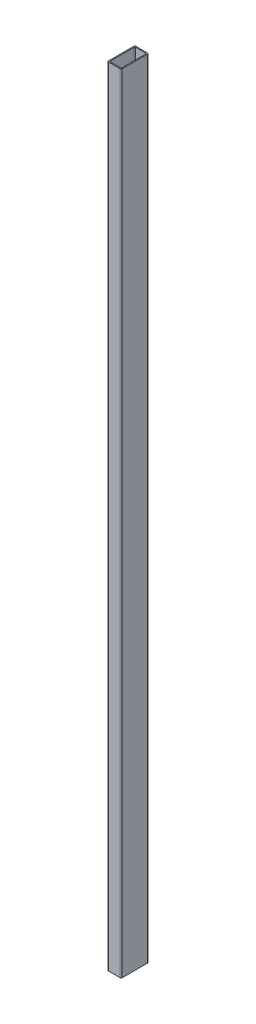
ISO-10303-21;
HEADER;
FILE_DESCRIPTION(('STEP AP214'),'2;1');
FILE_NAME('part.step','',(''),(''),'','','');
FILE_SCHEMA(('AUTOMOTIVE_DESIGN { 1 0 10303 214 1 1 1 1 }'));
ENDSEC;
DATA;
#1=APPLICATION_CONTEXT('core data for automotive mechanical design processes');
#2=APPLICATION_PROTOCOL_DEFINITION('international standard','automotive_design',2000,#1);
#3=PRODUCT_CONTEXT('',#1,'mechanical');
#4=PRODUCT('Part','Part','',(#3));
#5=PRODUCT_RELATED_PRODUCT_CATEGORY('part','',(#4));
#6=PRODUCT_DEFINITION_FORMATION('','',#4);
#7=PRODUCT_DEFINITION_CONTEXT('part definition',#1,'design');
#8=PRODUCT_DEFINITION('design','',#6,#7);
#9=PRODUCT_DEFINITION_SHAPE('','',#8);
#10=(LENGTH_UNIT() NAMED_UNIT(*) SI_UNIT(.MILLI.,.METRE.));
#11=(NAMED_UNIT(*) PLANE_ANGLE_UNIT() SI_UNIT($,.RADIAN.));
#12=(NAMED_UNIT(*) SI_UNIT($,.STERADIAN.) SOLID_ANGLE_UNIT());
#13=UNCERTAINTY_MEASURE_WITH_UNIT(LENGTH_MEASURE(1.E-05),#10,'distance_accuracy_value','');
#14=(GEOMETRIC_REPRESENTATION_CONTEXT(3) GLOBAL_UNCERTAINTY_ASSIGNED_CONTEXT((#13)) GLOBAL_UNIT_ASSIGNED_CONTEXT((#10,
#11,#12)) REPRESENTATION_CONTEXT('',''));
#15=CARTESIAN_POINT('',(0.,0.,0.));
#16=DIRECTION('',(0.,0.,1.));
#17=DIRECTION('',(1.,0.,0.));
#18=AXIS2_PLACEMENT_3D('',#15,#16,#17);
#19=CARTESIAN_POINT('',(-18.5,1149.29577045117,38.5));
#20=DIRECTION('',(0.,-1.,0.));
#21=DIRECTION('',(0.,0.,-1.));
#22=AXIS2_PLACEMENT_3D('',#19,#20,#21);
#23=PLANE('',#22);
#24=CARTESIAN_POINT('',(-18.5,1149.29577045117,38.5));
#25=DIRECTION('',(0.,1.,0.));
#26=DIRECTION('',(0.,0.,-1.));
#27=AXIS2_PLACEMENT_3D('',#24,#25,#26);
#28=CIRCLE('',#27,1.5);
#29=CARTESIAN_POINT('',(-20.,1149.29577045117,38.5));
#30=VERTEX_POINT('',#29);
#31=CARTESIAN_POINT('',(-18.5,1149.29577045117,40.));
#32=VERTEX_POINT('',#31);
#33=EDGE_CURVE('E212',#30,#32,#28,.T.);
#34=ORIENTED_EDGE('',*,*,#33,.T.);
#35=DIRECTION('',(1.,0.,0.));
#36=VECTOR('',#35,1.);
#37=CARTESIAN_POINT('',(-1.49999999999983,1149.29577045117,40.));
#38=LINE('',#37,#36);
#39=CARTESIAN_POINT('',(-1.49999999999983,1149.29577045117,40.));
#40=VERTEX_POINT('',#39);
#41=EDGE_CURVE('E215',#32,#40,#38,.T.);
#42=ORIENTED_EDGE('',*,*,#41,.T.);
#43=CARTESIAN_POINT('',(-1.49999999999983,1149.29577045117,38.5));
#44=DIRECTION('',(0.,1.,0.));
#45=DIRECTION('',(0.,0.,-1.));
#46=AXIS2_PLACEMENT_3D('',#43,#44,#45);
#47=CIRCLE('',#46,1.50000000000001);
#48=CARTESIAN_POINT('',(0.,1149.29577045117,38.5));
#49=VERTEX_POINT('',#48);
#50=EDGE_CURVE('E218',#40,#49,#47,.T.);
#51=ORIENTED_EDGE('',*,*,#50,.T.);
#52=DIRECTION('',(0.,0.,-1.));
#53=VECTOR('',#52,1.);
#54=CARTESIAN_POINT('',(0.,1149.29577045117,38.5));
#55=LINE('',#54,#53);
#56=CARTESIAN_POINT('',(0.,1149.29577045117,1.50000000000003));
#57=VERTEX_POINT('',#56);
#58=EDGE_CURVE('E220',#49,#57,#55,.T.);
#59=ORIENTED_EDGE('',*,*,#58,.T.);
#60=CARTESIAN_POINT('',(-1.49999999999983,1149.29577045117,1.50000000000003));
#61=DIRECTION('',(0.,1.,0.));
#62=DIRECTION('',(0.,0.,1.));
#63=AXIS2_PLACEMENT_3D('',#60,#61,#62);
#64=CIRCLE('',#63,1.5);
#65=CARTESIAN_POINT('',(-1.50000000000006,1149.29577045117,0.));
#66=VERTEX_POINT('',#65);
#67=EDGE_CURVE('E222',#57,#66,#64,.T.);
#68=ORIENTED_EDGE('',*,*,#67,.T.);
#69=DIRECTION('',(-1.,0.,0.));
#70=VECTOR('',#69,1.);
#71=CARTESIAN_POINT('',(-1.50000000000006,1149.29577045117,0.));
#72=LINE('',#71,#70);
#73=CARTESIAN_POINT('',(-18.5,1149.29577045117,0.));
#74=VERTEX_POINT('',#73);
#75=EDGE_CURVE('E224',#66,#74,#72,.T.);
#76=ORIENTED_EDGE('',*,*,#75,.T.);
#77=CARTESIAN_POINT('',(-18.5,1149.29577045117,1.50000000000003));
#78=DIRECTION('',(0.,1.,0.));
#79=DIRECTION('',(0.,0.,-1.));
#80=AXIS2_PLACEMENT_3D('',#77,#78,#79);
#81=CIRCLE('',#80,1.5);
#82=CARTESIAN_POINT('',(-20.,1149.29577045117,1.50000000000003));
#83=VERTEX_POINT('',#82);
#84=EDGE_CURVE('E226',#74,#83,#81,.T.);
#85=ORIENTED_EDGE('',*,*,#84,.T.);
#86=DIRECTION('',(0.,0.,1.));
#87=VECTOR('',#86,1.);
#88=CARTESIAN_POINT('',(-20.,1149.29577045117,38.5));
#89=LINE('',#88,#87);
#90=EDGE_CURVE('E228',#83,#30,#89,.T.);
#91=ORIENTED_EDGE('',*,*,#90,.T.);
#92=EDGE_LOOP('',(#34,#42,#51,#59,#68,#76,#85,#91));
#93=FACE_BOUND('',#92,.T.);
#94=CARTESIAN_POINT('',(-17.4999999999999,1149.29577045117,2.50000000000003));
#95=DIRECTION('',(0.,1.,0.));
#96=DIRECTION('',(0.,0.,-1.));
#97=AXIS2_PLACEMENT_3D('',#94,#95,#96);
#98=CIRCLE('',#97,0.999999999999994);
#99=CARTESIAN_POINT('',(-17.4999999999999,1149.29577045117,1.50000000000006));
#100=VERTEX_POINT('',#99);
#101=CARTESIAN_POINT('',(-18.5,1149.29577045117,2.50000000000003));
#102=VERTEX_POINT('',#101);
#103=EDGE_CURVE('E147',#100,#102,#98,.T.);
#104=ORIENTED_EDGE('',*,*,#103,.F.);
#105=DIRECTION('',(-1.,0.,0.));
#106=VECTOR('',#105,1.);
#107=CARTESIAN_POINT('',(-2.50000000000017,1149.29577045117,1.50000000000003));
#108=LINE('',#107,#106);
#109=CARTESIAN_POINT('',(-2.50000000000017,1149.29577045117,1.50000000000003));
#110=VERTEX_POINT('',#109);
#111=EDGE_CURVE('E180',#110,#100,#108,.T.);
#112=ORIENTED_EDGE('',*,*,#111,.F.);
#113=CARTESIAN_POINT('',(-2.50000000000017,1149.29577045117,2.50000000000003));
#114=DIRECTION('',(0.,1.,0.));
#115=DIRECTION('',(0.,0.,1.));
#116=AXIS2_PLACEMENT_3D('',#113,#114,#115);
#117=CIRCLE('',#116,0.999999999999997);
#118=CARTESIAN_POINT('',(-1.50000000000006,1149.29577045117,2.50000000000003));
#119=VERTEX_POINT('',#118);
#120=EDGE_CURVE('E178',#119,#110,#117,.T.);
#121=ORIENTED_EDGE('',*,*,#120,.F.);
#122=DIRECTION('',(0.,0.,-1.));
#123=VECTOR('',#122,1.);
#124=CARTESIAN_POINT('',(-1.49999999999983,1149.29577045117,37.5));
#125=LINE('',#124,#123);
#126=CARTESIAN_POINT('',(-1.49999999999983,1149.29577045117,37.5));
#127=VERTEX_POINT('',#126);
#128=EDGE_CURVE('E176',#127,#119,#125,.T.);
#129=ORIENTED_EDGE('',*,*,#128,.F.);
#130=CARTESIAN_POINT('',(-2.49999999999995,1149.29577045117,37.5));
#131=DIRECTION('',(0.,1.,0.));
#132=DIRECTION('',(0.,0.,-1.));
#133=AXIS2_PLACEMENT_3D('',#130,#131,#132);
#134=CIRCLE('',#133,1.);
#135=CARTESIAN_POINT('',(-2.49999999999995,1149.29577045117,38.5));
#136=VERTEX_POINT('',#135);
#137=EDGE_CURVE('E174',#136,#127,#134,.T.);
#138=ORIENTED_EDGE('',*,*,#137,.F.);
#139=DIRECTION('',(1.,0.,0.));
#140=VECTOR('',#139,1.);
#141=CARTESIAN_POINT('',(-2.49999999999995,1149.29577045117,38.5));
#142=LINE('',#141,#140);
#143=CARTESIAN_POINT('',(-17.4999999999999,1149.29577045117,38.5));
#144=VERTEX_POINT('',#143);
#145=EDGE_CURVE('E170',#144,#136,#142,.T.);
#146=ORIENTED_EDGE('',*,*,#145,.F.);
#147=CARTESIAN_POINT('',(-17.4999999999999,1149.29577045117,37.5));
#148=DIRECTION('',(0.,1.,0.));
#149=DIRECTION('',(0.,0.,-1.));
#150=AXIS2_PLACEMENT_3D('',#147,#148,#149);
#151=CIRCLE('',#150,1.);
#152=CARTESIAN_POINT('',(-18.5,1149.29577045117,37.5));
#153=VERTEX_POINT('',#152);
#154=EDGE_CURVE('E168',#153,#144,#151,.T.);
#155=ORIENTED_EDGE('',*,*,#154,.F.);
#156=DIRECTION('',(0.,0.,1.));
#157=VECTOR('',#156,1.);
#158=CARTESIAN_POINT('',(-18.5,1149.29577045117,37.5));
#159=LINE('',#158,#157);
#160=EDGE_CURVE('E155',#102,#153,#159,.T.);
#161=ORIENTED_EDGE('',*,*,#160,.F.);
#162=EDGE_LOOP('',(#104,#112,#121,#129,#138,#146,#155,#161));
#163=FACE_BOUND('',#162,.T.);
#164=ADVANCED_FACE('F34',(#93,#163),#23,.F.);
#165=CARTESIAN_POINT('',(-18.5,0.,38.5));
#166=DIRECTION('',(0.,-1.,0.));
#167=DIRECTION('',(0.,0.,-1.));
#168=AXIS2_PLACEMENT_3D('',#165,#166,#167);
#169=PLANE('',#168);
#170=CARTESIAN_POINT('',(-18.5,0.,38.5));
#171=DIRECTION('',(0.,1.,0.));
#172=DIRECTION('',(0.,0.,-1.));
#173=AXIS2_PLACEMENT_3D('',#170,#171,#172);
#174=CIRCLE('',#173,1.5);
#175=CARTESIAN_POINT('',(-20.,0.,38.5));
#176=VERTEX_POINT('',#175);
#177=CARTESIAN_POINT('',(-18.5,0.,40.));
#178=VERTEX_POINT('',#177);
#179=EDGE_CURVE('E163',#176,#178,#174,.T.);
#180=ORIENTED_EDGE('',*,*,#179,.F.);
#181=DIRECTION('',(0.,0.,1.));
#182=VECTOR('',#181,1.);
#183=CARTESIAN_POINT('',(-20.,0.,38.5));
#184=LINE('',#183,#182);
#185=CARTESIAN_POINT('',(-20.,0.,1.50000000000003));
#186=VERTEX_POINT('',#185);
#187=EDGE_CURVE('E216',#186,#176,#184,.T.);
#188=ORIENTED_EDGE('',*,*,#187,.F.);
#189=CARTESIAN_POINT('',(-18.5,0.,1.50000000000003));
#190=DIRECTION('',(0.,1.,0.));
#191=DIRECTION('',(0.,0.,-1.));
#192=AXIS2_PLACEMENT_3D('',#189,#190,#191);
#193=CIRCLE('',#192,1.5);
#194=CARTESIAN_POINT('',(-18.5,0.,0.));
#195=VERTEX_POINT('',#194);
#196=EDGE_CURVE('E243',#195,#186,#193,.T.);
#197=ORIENTED_EDGE('',*,*,#196,.F.);
#198=DIRECTION('',(-1.,0.,0.));
#199=VECTOR('',#198,1.);
#200=CARTESIAN_POINT('',(-1.50000000000006,0.,0.));
#201=LINE('',#200,#199);
#202=CARTESIAN_POINT('',(-1.50000000000006,0.,0.));
#203=VERTEX_POINT('',#202);
#204=EDGE_CURVE('E241',#203,#195,#201,.T.);
#205=ORIENTED_EDGE('',*,*,#204,.F.);
#206=CARTESIAN_POINT('',(-1.49999999999983,0.,1.50000000000003));
#207=DIRECTION('',(0.,1.,0.));
#208=DIRECTION('',(0.,0.,1.));
#209=AXIS2_PLACEMENT_3D('',#206,#207,#208);
#210=CIRCLE('',#209,1.5);
#211=CARTESIAN_POINT('',(0.,0.,1.50000000000003));
#212=VERTEX_POINT('',#211);
#213=EDGE_CURVE('E239',#212,#203,#210,.T.);
#214=ORIENTED_EDGE('',*,*,#213,.F.);
#215=DIRECTION('',(0.,0.,-1.));
#216=VECTOR('',#215,1.);
#217=CARTESIAN_POINT('',(0.,0.,38.5));
#218=LINE('',#217,#216);
#219=CARTESIAN_POINT('',(0.,0.,38.5));
#220=VERTEX_POINT('',#219);
#221=EDGE_CURVE('E237',#220,#212,#218,.T.);
#222=ORIENTED_EDGE('',*,*,#221,.F.);
#223=CARTESIAN_POINT('',(-1.49999999999983,0.,38.5));
#224=DIRECTION('',(0.,1.,0.));
#225=DIRECTION('',(0.,0.,-1.));
#226=AXIS2_PLACEMENT_3D('',#223,#224,#225);
#227=CIRCLE('',#226,1.50000000000001);
#228=CARTESIAN_POINT('',(-1.49999999999983,0.,40.));
#229=VERTEX_POINT('',#228);
#230=EDGE_CURVE('E235',#229,#220,#227,.T.);
#231=ORIENTED_EDGE('',*,*,#230,.F.);
#232=DIRECTION('',(1.,0.,0.));
#233=VECTOR('',#232,1.);
#234=CARTESIAN_POINT('',(-1.49999999999983,0.,40.));
#235=LINE('',#234,#233);
#236=EDGE_CURVE('E233',#178,#229,#235,.T.);
#237=ORIENTED_EDGE('',*,*,#236,.F.);
#238=EDGE_LOOP('',(#180,#188,#197,#205,#214,#222,#231,#237));
#239=FACE_BOUND('',#238,.T.);
#240=DIRECTION('',(-1.,0.,0.));
#241=VECTOR('',#240,1.);
#242=CARTESIAN_POINT('',(-2.50000000000017,0.,1.50000000000003));
#243=LINE('',#242,#241);
#244=CARTESIAN_POINT('',(-2.50000000000017,0.,1.50000000000003));
#245=VERTEX_POINT('',#244);
#246=CARTESIAN_POINT('',(-17.4999999999999,0.,1.50000000000003));
#247=VERTEX_POINT('',#246);
#248=EDGE_CURVE('E156',#245,#247,#243,.T.);
#249=ORIENTED_EDGE('',*,*,#248,.T.);
#250=CARTESIAN_POINT('',(-17.4999999999999,0.,2.50000000000003));
#251=DIRECTION('',(0.,1.,0.));
#252=DIRECTION('',(0.,0.,-1.));
#253=AXIS2_PLACEMENT_3D('',#250,#251,#252);
#254=CIRCLE('',#253,0.999999999999994);
#255=CARTESIAN_POINT('',(-18.5,0.,2.50000000000003));
#256=VERTEX_POINT('',#255);
#257=EDGE_CURVE('E57',#247,#256,#254,.T.);
#258=ORIENTED_EDGE('',*,*,#257,.T.);
#259=DIRECTION('',(0.,0.,1.));
#260=VECTOR('',#259,1.);
#261=CARTESIAN_POINT('',(-18.5,0.,37.5));
#262=LINE('',#261,#260);
#263=CARTESIAN_POINT('',(-18.5,0.,37.5));
#264=VERTEX_POINT('',#263);
#265=EDGE_CURVE('E162',#256,#264,#262,.T.);
#266=ORIENTED_EDGE('',*,*,#265,.T.);
#267=CARTESIAN_POINT('',(-17.4999999999999,0.,37.5));
#268=DIRECTION('',(0.,1.,0.));
#269=DIRECTION('',(0.,0.,-1.));
#270=AXIS2_PLACEMENT_3D('',#267,#268,#269);
#271=CIRCLE('',#270,1.);
#272=CARTESIAN_POINT('',(-17.4999999999999,0.,38.5));
#273=VERTEX_POINT('',#272);
#274=EDGE_CURVE('E184',#264,#273,#271,.T.);
#275=ORIENTED_EDGE('',*,*,#274,.T.);
#276=DIRECTION('',(1.,0.,0.));
#277=VECTOR('',#276,1.);
#278=CARTESIAN_POINT('',(-2.49999999999995,0.,38.5));
#279=LINE('',#278,#277);
#280=CARTESIAN_POINT('',(-2.49999999999995,0.,38.5));
#281=VERTEX_POINT('',#280);
#282=EDGE_CURVE('E187',#273,#281,#279,.T.);
#283=ORIENTED_EDGE('',*,*,#282,.T.);
#284=CARTESIAN_POINT('',(-2.49999999999995,0.,37.5));
#285=DIRECTION('',(0.,1.,0.));
#286=DIRECTION('',(0.,0.,-1.));
#287=AXIS2_PLACEMENT_3D('',#284,#285,#286);
#288=CIRCLE('',#287,1.);
#289=CARTESIAN_POINT('',(-1.49999999999983,0.,37.5));
#290=VERTEX_POINT('',#289);
#291=EDGE_CURVE('E190',#281,#290,#288,.T.);
#292=ORIENTED_EDGE('',*,*,#291,.T.);
#293=DIRECTION('',(0.,0.,-1.));
#294=VECTOR('',#293,1.);
#295=CARTESIAN_POINT('',(-1.49999999999983,0.,37.5));
#296=LINE('',#295,#294);
#297=CARTESIAN_POINT('',(-1.50000000000006,0.,2.50000000000003));
#298=VERTEX_POINT('',#297);
#299=EDGE_CURVE('E193',#290,#298,#296,.T.);
#300=ORIENTED_EDGE('',*,*,#299,.T.);
#301=CARTESIAN_POINT('',(-2.50000000000017,0.,2.50000000000003));
#302=DIRECTION('',(0.,1.,0.));
#303=DIRECTION('',(0.,0.,1.));
#304=AXIS2_PLACEMENT_3D('',#301,#302,#303);
#305=CIRCLE('',#304,0.999999999999997);
#306=EDGE_CURVE('E196',#298,#245,#305,.T.);
#307=ORIENTED_EDGE('',*,*,#306,.T.);
#308=EDGE_LOOP('',(#249,#258,#266,#275,#283,#292,#300,#307));
#309=FACE_BOUND('',#308,.T.);
#310=ADVANCED_FACE('F273',(#239,#309),#169,.T.);
#311=CARTESIAN_POINT('',(-18.5,1149.29577045117,38.5));
#312=DIRECTION('',(0.,-1.,0.));
#313=DIRECTION('',(0.,0.,-1.));
#314=AXIS2_PLACEMENT_3D('',#311,#312,#313);
#315=CYLINDRICAL_SURFACE('',#314,1.5);
#316=ORIENTED_EDGE('',*,*,#179,.T.);
#317=DIRECTION('',(0.,-1.,0.));
#318=VECTOR('',#317,1.);
#319=CARTESIAN_POINT('',(-18.5,1149.29577045117,40.));
#320=LINE('',#319,#318);
#321=EDGE_CURVE('E11',#32,#178,#320,.T.);
#322=ORIENTED_EDGE('',*,*,#321,.F.);
#323=ORIENTED_EDGE('',*,*,#33,.F.);
#324=DIRECTION('',(0.,-1.,0.));
#325=VECTOR('',#324,1.);
#326=CARTESIAN_POINT('',(-20.,1149.29577045117,38.5));
#327=LINE('',#326,#325);
#328=EDGE_CURVE('E230',#30,#176,#327,.T.);
#329=ORIENTED_EDGE('',*,*,#328,.T.);
#330=EDGE_LOOP('',(#316,#322,#323,#329));
#331=FACE_BOUND('',#330,.T.);
#332=ADVANCED_FACE('F36',(#331),#315,.T.);
#333=CARTESIAN_POINT('',(-1.49999999999983,1149.29577045117,40.));
#334=DIRECTION('',(0.,0.,-1.));
#335=DIRECTION('',(-1.,0.,0.));
#336=AXIS2_PLACEMENT_3D('',#333,#334,#335);
#337=PLANE('',#336);
#338=ORIENTED_EDGE('',*,*,#236,.T.);
#339=DIRECTION('',(0.,-1.,0.));
#340=VECTOR('',#339,1.);
#341=CARTESIAN_POINT('',(-1.49999999999983,1149.29577045117,40.));
#342=LINE('',#341,#340);
#343=EDGE_CURVE('E42',#40,#229,#342,.T.);
#344=ORIENTED_EDGE('',*,*,#343,.F.);
#345=ORIENTED_EDGE('',*,*,#41,.F.);
#346=ORIENTED_EDGE('',*,*,#321,.T.);
#347=EDGE_LOOP('',(#338,#344,#345,#346));
#348=FACE_BOUND('',#347,.T.);
#349=ADVANCED_FACE('F290',(#348),#337,.F.);
#350=CARTESIAN_POINT('',(-1.49999999999983,1149.29577045117,38.5));
#351=DIRECTION('',(0.,-1.,0.));
#352=DIRECTION('',(0.,0.,-1.));
#353=AXIS2_PLACEMENT_3D('',#350,#351,#352);
#354=CYLINDRICAL_SURFACE('',#353,1.50000000000001);
#355=ORIENTED_EDGE('',*,*,#230,.T.);
#356=DIRECTION('',(0.,-1.,0.));
#357=VECTOR('',#356,1.);
#358=CARTESIAN_POINT('',(0.,1149.29577045117,38.5));
#359=LINE('',#358,#357);
#360=EDGE_CURVE('E260',#49,#220,#359,.T.);
#361=ORIENTED_EDGE('',*,*,#360,.F.);
#362=ORIENTED_EDGE('',*,*,#50,.F.);
#363=ORIENTED_EDGE('',*,*,#343,.T.);
#364=EDGE_LOOP('',(#355,#361,#362,#363));
#365=FACE_BOUND('',#364,.T.);
#366=ADVANCED_FACE('F267',(#365),#354,.T.);
#367=CARTESIAN_POINT('',(0.,1149.29577045117,38.5));
#368=DIRECTION('',(-1.,0.,0.));
#369=DIRECTION('',(0.,0.,1.));
#370=AXIS2_PLACEMENT_3D('',#367,#368,#369);
#371=PLANE('',#370);
#372=ORIENTED_EDGE('',*,*,#221,.T.);
#373=DIRECTION('',(0.,-1.,0.));
#374=VECTOR('',#373,1.);
#375=CARTESIAN_POINT('',(0.,1149.29577045117,1.50000000000003));
#376=LINE('',#375,#374);
#377=EDGE_CURVE('E257',#57,#212,#376,.T.);
#378=ORIENTED_EDGE('',*,*,#377,.F.);
#379=ORIENTED_EDGE('',*,*,#58,.F.);
#380=ORIENTED_EDGE('',*,*,#360,.T.);
#381=EDGE_LOOP('',(#372,#378,#379,#380));
#382=FACE_BOUND('',#381,.T.);
#383=ADVANCED_FACE('F279',(#382),#371,.F.);
#384=CARTESIAN_POINT('',(-1.49999999999983,1149.29577045117,1.50000000000003));
#385=DIRECTION('',(0.,-1.,0.));
#386=DIRECTION('',(0.,0.,-1.));
#387=AXIS2_PLACEMENT_3D('',#384,#385,#386);
#388=CYLINDRICAL_SURFACE('',#387,1.5);
#389=ORIENTED_EDGE('',*,*,#213,.T.);
#390=DIRECTION('',(0.,-1.,0.));
#391=VECTOR('',#390,1.);
#392=CARTESIAN_POINT('',(-1.50000000000006,1149.29577045117,0.));
#393=LINE('',#392,#391);
#394=EDGE_CURVE('E254',#66,#203,#393,.T.);
#395=ORIENTED_EDGE('',*,*,#394,.F.);
#396=ORIENTED_EDGE('',*,*,#67,.F.);
#397=ORIENTED_EDGE('',*,*,#377,.T.);
#398=EDGE_LOOP('',(#389,#395,#396,#397));
#399=FACE_BOUND('',#398,.T.);
#400=ADVANCED_FACE('F283',(#399),#388,.T.);
#401=CARTESIAN_POINT('',(-1.50000000000006,1149.29577045117,0.));
#402=DIRECTION('',(0.,0.,1.));
#403=DIRECTION('',(1.,0.,0.));
#404=AXIS2_PLACEMENT_3D('',#401,#402,#403);
#405=PLANE('',#404);
#406=ORIENTED_EDGE('',*,*,#204,.T.);
#407=DIRECTION('',(0.,-1.,0.));
#408=VECTOR('',#407,1.);
#409=CARTESIAN_POINT('',(-18.5,1149.29577045117,0.));
#410=LINE('',#409,#408);
#411=EDGE_CURVE('E251',#74,#195,#410,.T.);
#412=ORIENTED_EDGE('',*,*,#411,.F.);
#413=ORIENTED_EDGE('',*,*,#75,.F.);
#414=ORIENTED_EDGE('',*,*,#394,.T.);
#415=EDGE_LOOP('',(#406,#412,#413,#414));
#416=FACE_BOUND('',#415,.T.);
#417=ADVANCED_FACE('F303',(#416),#405,.F.);
#418=CARTESIAN_POINT('',(-18.5,1149.29577045117,1.50000000000003));
#419=DIRECTION('',(0.,-1.,0.));
#420=DIRECTION('',(0.,0.,-1.));
#421=AXIS2_PLACEMENT_3D('',#418,#419,#420);
#422=CYLINDRICAL_SURFACE('',#421,1.5);
#423=ORIENTED_EDGE('',*,*,#196,.T.);
#424=DIRECTION('',(0.,-1.,0.));
#425=VECTOR('',#424,1.);
#426=CARTESIAN_POINT('',(-20.,1149.29577045117,1.50000000000003));
#427=LINE('',#426,#425);
#428=EDGE_CURVE('E248',#83,#186,#427,.T.);
#429=ORIENTED_EDGE('',*,*,#428,.F.);
#430=ORIENTED_EDGE('',*,*,#84,.F.);
#431=ORIENTED_EDGE('',*,*,#411,.T.);
#432=EDGE_LOOP('',(#423,#429,#430,#431));
#433=FACE_BOUND('',#432,.T.);
#434=ADVANCED_FACE('F301',(#433),#422,.T.);
#435=CARTESIAN_POINT('',(-20.,1149.29577045117,38.5));
#436=DIRECTION('',(1.,0.,0.));
#437=DIRECTION('',(0.,0.,-1.));
#438=AXIS2_PLACEMENT_3D('',#435,#436,#437);
#439=PLANE('',#438);
#440=ORIENTED_EDGE('',*,*,#187,.T.);
#441=ORIENTED_EDGE('',*,*,#328,.F.);
#442=ORIENTED_EDGE('',*,*,#90,.F.);
#443=ORIENTED_EDGE('',*,*,#428,.T.);
#444=EDGE_LOOP('',(#440,#441,#442,#443));
#445=FACE_BOUND('',#444,.T.);
#446=ADVANCED_FACE('F296',(#445),#439,.F.);
#447=CARTESIAN_POINT('',(-17.4999999999999,1149.29577045117,2.50000000000003));
#448=DIRECTION('',(0.,-1.,0.));
#449=DIRECTION('',(0.,0.,-1.));
#450=AXIS2_PLACEMENT_3D('',#447,#448,#449);
#451=CYLINDRICAL_SURFACE('',#450,0.999999999999994);
#452=ORIENTED_EDGE('',*,*,#257,.F.);
#453=DIRECTION('',(0.,-1.,0.));
#454=VECTOR('',#453,1.);
#455=CARTESIAN_POINT('',(-17.4999999999999,1149.29577045117,1.50000000000006));
#456=LINE('',#455,#454);
#457=EDGE_CURVE('E151',#100,#247,#456,.T.);
#458=ORIENTED_EDGE('',*,*,#457,.F.);
#459=ORIENTED_EDGE('',*,*,#103,.T.);
#460=DIRECTION('',(0.,-1.,0.));
#461=VECTOR('',#460,1.);
#462=CARTESIAN_POINT('',(-18.5,1149.29577045117,2.50000000000003));
#463=LINE('',#462,#461);
#464=EDGE_CURVE('E150',#102,#256,#463,.T.);
#465=ORIENTED_EDGE('',*,*,#464,.T.);
#466=EDGE_LOOP('',(#452,#458,#459,#465));
#467=FACE_BOUND('',#466,.T.);
#468=ADVANCED_FACE('F149',(#467),#451,.F.);
#469=CARTESIAN_POINT('',(-18.5,1149.29577045117,37.5));
#470=DIRECTION('',(1.,0.,0.));
#471=DIRECTION('',(0.,0.,-1.));
#472=AXIS2_PLACEMENT_3D('',#469,#470,#471);
#473=PLANE('',#472);
#474=ORIENTED_EDGE('',*,*,#265,.F.);
#475=ORIENTED_EDGE('',*,*,#464,.F.);
#476=ORIENTED_EDGE('',*,*,#160,.T.);
#477=DIRECTION('',(0.,-1.,0.));
#478=VECTOR('',#477,1.);
#479=CARTESIAN_POINT('',(-18.5,1149.29577045117,37.5));
#480=LINE('',#479,#478);
#481=EDGE_CURVE('E164',#153,#264,#480,.T.);
#482=ORIENTED_EDGE('',*,*,#481,.T.);
#483=EDGE_LOOP('',(#474,#475,#476,#482));
#484=FACE_BOUND('',#483,.T.);
#485=ADVANCED_FACE('F159',(#484),#473,.T.);
#486=CARTESIAN_POINT('',(-17.4999999999999,1149.29577045117,37.5));
#487=DIRECTION('',(0.,-1.,0.));
#488=DIRECTION('',(0.,0.,-1.));
#489=AXIS2_PLACEMENT_3D('',#486,#487,#488);
#490=CYLINDRICAL_SURFACE('',#489,1.);
#491=ORIENTED_EDGE('',*,*,#274,.F.);
#492=ORIENTED_EDGE('',*,*,#481,.F.);
#493=ORIENTED_EDGE('',*,*,#154,.T.);
#494=DIRECTION('',(0.,-1.,0.));
#495=VECTOR('',#494,1.);
#496=CARTESIAN_POINT('',(-17.4999999999999,1149.29577045117,38.5));
#497=LINE('',#496,#495);
#498=EDGE_CURVE('E209',#144,#273,#497,.T.);
#499=ORIENTED_EDGE('',*,*,#498,.T.);
#500=EDGE_LOOP('',(#491,#492,#493,#499));
#501=FACE_BOUND('',#500,.T.);
#502=ADVANCED_FACE('F328',(#501),#490,.F.);
#503=CARTESIAN_POINT('',(-2.49999999999995,1149.29577045117,38.5));
#504=DIRECTION('',(0.,0.,-1.));
#505=DIRECTION('',(-1.,0.,0.));
#506=AXIS2_PLACEMENT_3D('',#503,#504,#505);
#507=PLANE('',#506);
#508=ORIENTED_EDGE('',*,*,#282,.F.);
#509=ORIENTED_EDGE('',*,*,#498,.F.);
#510=ORIENTED_EDGE('',*,*,#145,.T.);
#511=DIRECTION('',(0.,-1.,0.));
#512=VECTOR('',#511,1.);
#513=CARTESIAN_POINT('',(-2.49999999999995,1149.29577045117,38.5));
#514=LINE('',#513,#512);
#515=EDGE_CURVE('E207',#136,#281,#514,.T.);
#516=ORIENTED_EDGE('',*,*,#515,.T.);
#517=EDGE_LOOP('',(#508,#509,#510,#516));
#518=FACE_BOUND('',#517,.T.);
#519=ADVANCED_FACE('F332',(#518),#507,.T.);
#520=CARTESIAN_POINT('',(-2.49999999999995,1149.29577045117,37.5));
#521=DIRECTION('',(0.,-1.,0.));
#522=DIRECTION('',(0.,0.,-1.));
#523=AXIS2_PLACEMENT_3D('',#520,#521,#522);
#524=CYLINDRICAL_SURFACE('',#523,1.);
#525=ORIENTED_EDGE('',*,*,#291,.F.);
#526=ORIENTED_EDGE('',*,*,#515,.F.);
#527=ORIENTED_EDGE('',*,*,#137,.T.);
#528=DIRECTION('',(0.,-1.,0.));
#529=VECTOR('',#528,1.);
#530=CARTESIAN_POINT('',(-1.49999999999983,1149.29577045117,37.5));
#531=LINE('',#530,#529);
#532=EDGE_CURVE('E205',#127,#290,#531,.T.);
#533=ORIENTED_EDGE('',*,*,#532,.T.);
#534=EDGE_LOOP('',(#525,#526,#527,#533));
#535=FACE_BOUND('',#534,.T.);
#536=ADVANCED_FACE('F338',(#535),#524,.F.);
#537=CARTESIAN_POINT('',(-1.49999999999983,1149.29577045117,37.5));
#538=DIRECTION('',(-1.,0.,0.));
#539=DIRECTION('',(0.,0.,1.));
#540=AXIS2_PLACEMENT_3D('',#537,#538,#539);
#541=PLANE('',#540);
#542=ORIENTED_EDGE('',*,*,#299,.F.);
#543=ORIENTED_EDGE('',*,*,#532,.F.);
#544=ORIENTED_EDGE('',*,*,#128,.T.);
#545=DIRECTION('',(0.,-1.,0.));
#546=VECTOR('',#545,1.);
#547=CARTESIAN_POINT('',(-1.50000000000006,1149.29577045117,2.50000000000003));
#548=LINE('',#547,#546);
#549=EDGE_CURVE('E203',#119,#298,#548,.T.);
#550=ORIENTED_EDGE('',*,*,#549,.T.);
#551=EDGE_LOOP('',(#542,#543,#544,#550));
#552=FACE_BOUND('',#551,.T.);
#553=ADVANCED_FACE('F342',(#552),#541,.T.);
#554=CARTESIAN_POINT('',(-2.50000000000017,1149.29577045117,2.50000000000003));
#555=DIRECTION('',(0.,-1.,0.));
#556=DIRECTION('',(0.,0.,-1.));
#557=AXIS2_PLACEMENT_3D('',#554,#555,#556);
#558=CYLINDRICAL_SURFACE('',#557,0.999999999999997);
#559=ORIENTED_EDGE('',*,*,#306,.F.);
#560=ORIENTED_EDGE('',*,*,#549,.F.);
#561=ORIENTED_EDGE('',*,*,#120,.T.);
#562=DIRECTION('',(0.,-1.,0.));
#563=VECTOR('',#562,1.);
#564=CARTESIAN_POINT('',(-2.50000000000017,1149.29577045117,1.50000000000003));
#565=LINE('',#564,#563);
#566=EDGE_CURVE('E49',#110,#245,#565,.T.);
#567=ORIENTED_EDGE('',*,*,#566,.T.);
#568=EDGE_LOOP('',(#559,#560,#561,#567));
#569=FACE_BOUND('',#568,.T.);
#570=ADVANCED_FACE('F346',(#569),#558,.F.);
#571=CARTESIAN_POINT('',(-2.50000000000017,1149.29577045117,1.50000000000003));
#572=DIRECTION('',(0.,0.,1.));
#573=DIRECTION('',(1.,0.,0.));
#574=AXIS2_PLACEMENT_3D('',#571,#572,#573);
#575=PLANE('',#574);
#576=ORIENTED_EDGE('',*,*,#248,.F.);
#577=ORIENTED_EDGE('',*,*,#566,.F.);
#578=ORIENTED_EDGE('',*,*,#111,.T.);
#579=ORIENTED_EDGE('',*,*,#457,.T.);
#580=EDGE_LOOP('',(#576,#577,#578,#579));
#581=FACE_BOUND('',#580,.T.);
#582=ADVANCED_FACE('F350',(#581),#575,.T.);
#583=CLOSED_SHELL('',(#164,#310,#332,#349,#366,#383,#400,#417,#434,#446,#468,#485,#502,#519,
#536,#553,#570,#582));
#584=MANIFOLD_SOLID_BREP('B2',#583);
#585=ADVANCED_BREP_SHAPE_REPRESENTATION('',(#18,#584),#14);
#586=SHAPE_DEFINITION_REPRESENTATION(#9,#585);
ENDSEC;
END-ISO-10303-21;
